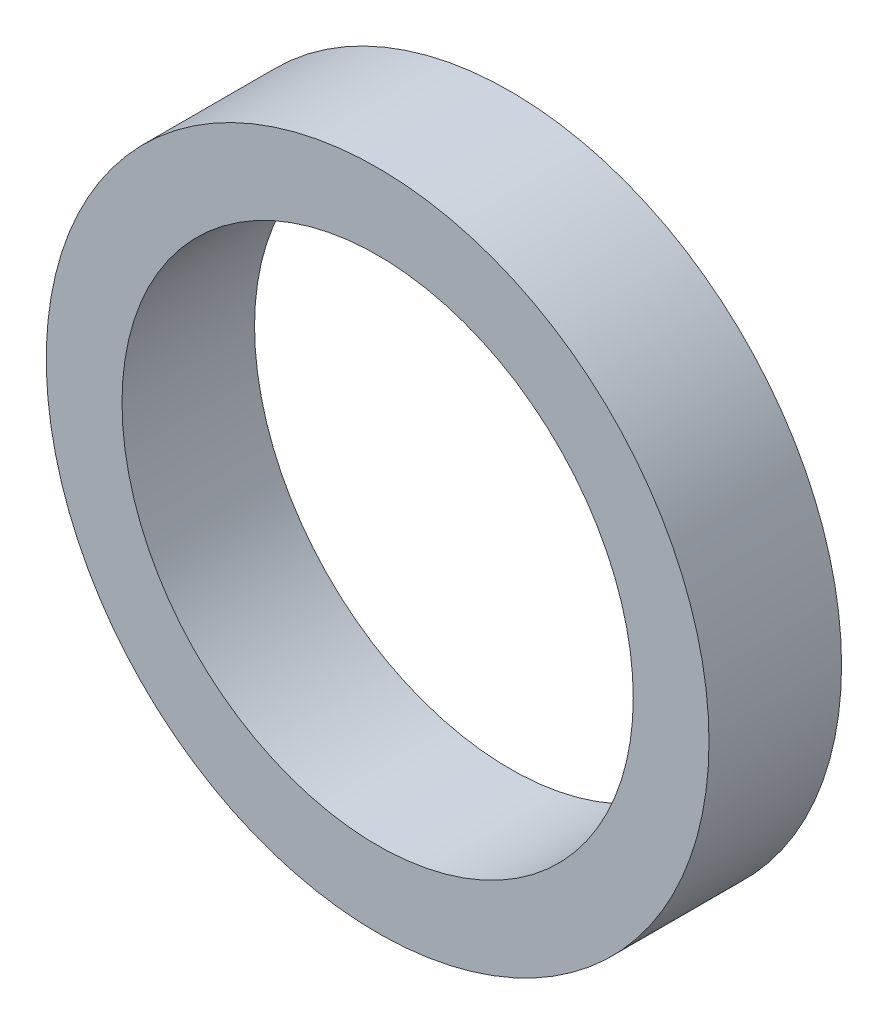
ISO-10303-21;
HEADER;
FILE_DESCRIPTION(('STEP AP214'),'2;1');
FILE_NAME('part.step','',(''),(''),'','','');
FILE_SCHEMA(('AUTOMOTIVE_DESIGN { 1 0 10303 214 1 1 1 1 }'));
ENDSEC;
DATA;
#1=APPLICATION_CONTEXT('core data for automotive mechanical design processes');
#2=APPLICATION_PROTOCOL_DEFINITION('international standard','automotive_design',2000,#1);
#3=PRODUCT_CONTEXT('',#1,'mechanical');
#4=PRODUCT('Part','Part','',(#3));
#5=PRODUCT_RELATED_PRODUCT_CATEGORY('part','',(#4));
#6=PRODUCT_DEFINITION_FORMATION('','',#4);
#7=PRODUCT_DEFINITION_CONTEXT('part definition',#1,'design');
#8=PRODUCT_DEFINITION('design','',#6,#7);
#9=PRODUCT_DEFINITION_SHAPE('','',#8);
#10=(LENGTH_UNIT() NAMED_UNIT(*) SI_UNIT(.MILLI.,.METRE.));
#11=(NAMED_UNIT(*) PLANE_ANGLE_UNIT() SI_UNIT($,.RADIAN.));
#12=(NAMED_UNIT(*) SI_UNIT($,.STERADIAN.) SOLID_ANGLE_UNIT());
#13=UNCERTAINTY_MEASURE_WITH_UNIT(LENGTH_MEASURE(1.E-05),#10,'distance_accuracy_value','');
#14=(GEOMETRIC_REPRESENTATION_CONTEXT(3) GLOBAL_UNCERTAINTY_ASSIGNED_CONTEXT((#13)) GLOBAL_UNIT_ASSIGNED_CONTEXT((#10,
#11,#12)) REPRESENTATION_CONTEXT('',''));
#15=CARTESIAN_POINT('',(0.,0.,0.));
#16=DIRECTION('',(0.,0.,1.));
#17=DIRECTION('',(1.,0.,0.));
#18=AXIS2_PLACEMENT_3D('',#15,#16,#17);
#19=CARTESIAN_POINT('',(0.,0.,1.4));
#20=DIRECTION('',(0.,0.,1.));
#21=DIRECTION('',(1.,0.,0.));
#22=AXIS2_PLACEMENT_3D('',#19,#20,#21);
#23=PLANE('',#22);
#24=CARTESIAN_POINT('',(0.,0.,1.4));
#25=DIRECTION('',(0.,0.,1.));
#26=DIRECTION('',(1.,0.,0.));
#27=AXIS2_PLACEMENT_3D('',#24,#25,#26);
#28=CIRCLE('',#27,7.);
#29=CARTESIAN_POINT('',(7.,0.,1.4));
#30=VERTEX_POINT('',#29);
#31=EDGE_CURVE('E10',#30,#30,#28,.T.);
#32=ORIENTED_EDGE('',*,*,#31,.T.);
#33=EDGE_LOOP('',(#32));
#34=FACE_BOUND('',#33,.T.);
#35=CARTESIAN_POINT('',(0.,0.,1.4));
#36=DIRECTION('',(0.,0.,1.));
#37=DIRECTION('',(1.,0.,0.));
#38=AXIS2_PLACEMENT_3D('',#35,#36,#37);
#39=CIRCLE('',#38,5.4);
#40=CARTESIAN_POINT('',(5.4,0.,1.4));
#41=VERTEX_POINT('',#40);
#42=EDGE_CURVE('E50',#41,#41,#39,.T.);
#43=ORIENTED_EDGE('',*,*,#42,.F.);
#44=EDGE_LOOP('',(#43));
#45=FACE_BOUND('',#44,.T.);
#46=ADVANCED_FACE('F37',(#34,#45),#23,.T.);
#47=CARTESIAN_POINT('',(0.,0.,-1.4));
#48=DIRECTION('',(0.,0.,1.));
#49=DIRECTION('',(1.,0.,0.));
#50=AXIS2_PLACEMENT_3D('',#47,#48,#49);
#51=PLANE('',#50);
#52=CARTESIAN_POINT('',(0.,0.,-1.4));
#53=DIRECTION('',(0.,0.,1.));
#54=DIRECTION('',(1.,0.,0.));
#55=AXIS2_PLACEMENT_3D('',#52,#53,#54);
#56=CIRCLE('',#55,7.);
#57=CARTESIAN_POINT('',(7.,0.,-1.4));
#58=VERTEX_POINT('',#57);
#59=EDGE_CURVE('E41',#58,#58,#56,.T.);
#60=ORIENTED_EDGE('',*,*,#59,.F.);
#61=EDGE_LOOP('',(#60));
#62=FACE_BOUND('',#61,.T.);
#63=CARTESIAN_POINT('',(0.,0.,-1.4));
#64=DIRECTION('',(0.,0.,1.));
#65=DIRECTION('',(1.,0.,0.));
#66=AXIS2_PLACEMENT_3D('',#63,#64,#65);
#67=CIRCLE('',#66,5.4);
#68=CARTESIAN_POINT('',(5.4,0.,-1.4));
#69=VERTEX_POINT('',#68);
#70=EDGE_CURVE('E52',#69,#69,#67,.T.);
#71=ORIENTED_EDGE('',*,*,#70,.T.);
#72=EDGE_LOOP('',(#71));
#73=FACE_BOUND('',#72,.T.);
#74=ADVANCED_FACE('F64',(#62,#73),#51,.F.);
#75=CARTESIAN_POINT('',(0.,0.,1.4));
#76=DIRECTION('',(0.,0.,-1.));
#77=DIRECTION('',(-1.,0.,0.));
#78=AXIS2_PLACEMENT_3D('',#75,#76,#77);
#79=CYLINDRICAL_SURFACE('',#78,7.);
#80=ORIENTED_EDGE('',*,*,#31,.F.);
#81=EDGE_LOOP('',(#80));
#82=FACE_BOUND('',#81,.T.);
#83=ORIENTED_EDGE('',*,*,#59,.T.);
#84=EDGE_LOOP('',(#83));
#85=FACE_BOUND('',#84,.T.);
#86=ADVANCED_FACE('F39',(#82,#85),#79,.T.);
#87=CARTESIAN_POINT('',(0.,0.,1.4));
#88=DIRECTION('',(0.,0.,-1.));
#89=DIRECTION('',(-1.,0.,0.));
#90=AXIS2_PLACEMENT_3D('',#87,#88,#89);
#91=CYLINDRICAL_SURFACE('',#90,5.4);
#92=ORIENTED_EDGE('',*,*,#42,.T.);
#93=EDGE_LOOP('',(#92));
#94=FACE_BOUND('',#93,.T.);
#95=ORIENTED_EDGE('',*,*,#70,.F.);
#96=EDGE_LOOP('',(#95));
#97=FACE_BOUND('',#96,.T.);
#98=ADVANCED_FACE('F60',(#94,#97),#91,.F.);
#99=CLOSED_SHELL('',(#46,#74,#86,#98));
#100=MANIFOLD_SOLID_BREP('B2',#99);
#101=ADVANCED_BREP_SHAPE_REPRESENTATION('',(#18,#100),#14);
#102=SHAPE_DEFINITION_REPRESENTATION(#9,#101);
ENDSEC;
END-ISO-10303-21;
